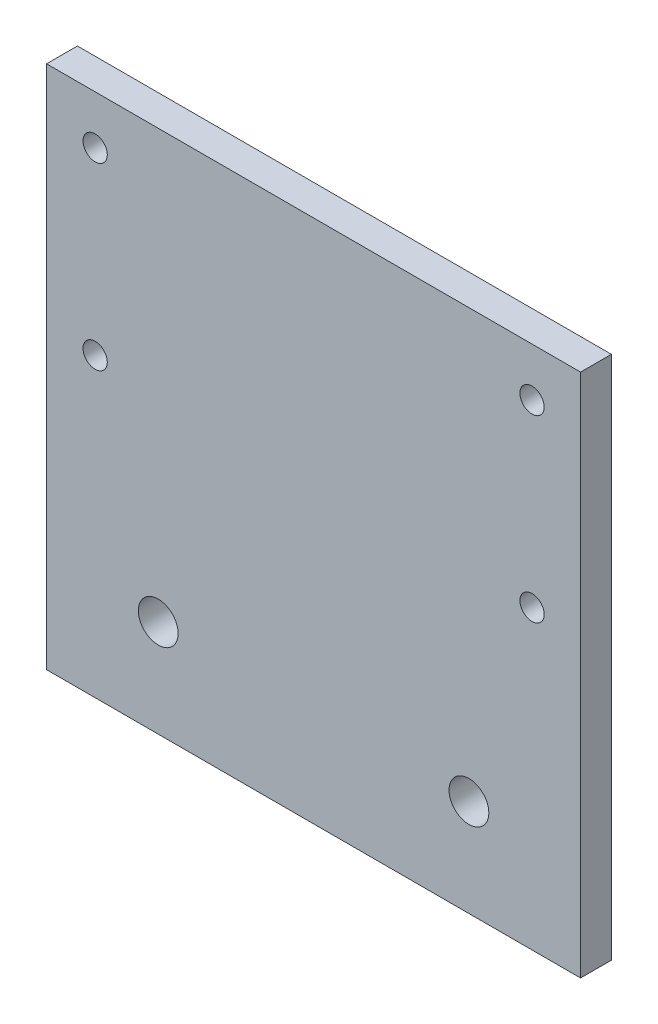
ISO-10303-21;
HEADER;
FILE_DESCRIPTION(('STEP AP214'),'2;1');
FILE_NAME('part.step','',(''),(''),'','','');
FILE_SCHEMA(('AUTOMOTIVE_DESIGN { 1 0 10303 214 1 1 1 1 }'));
ENDSEC;
DATA;
#1=APPLICATION_CONTEXT('core data for automotive mechanical design processes');
#2=APPLICATION_PROTOCOL_DEFINITION('international standard','automotive_design',2000,#1);
#3=PRODUCT_CONTEXT('',#1,'mechanical');
#4=PRODUCT('Part','Part','',(#3));
#5=PRODUCT_RELATED_PRODUCT_CATEGORY('part','',(#4));
#6=PRODUCT_DEFINITION_FORMATION('','',#4);
#7=PRODUCT_DEFINITION_CONTEXT('part definition',#1,'design');
#8=PRODUCT_DEFINITION('design','',#6,#7);
#9=PRODUCT_DEFINITION_SHAPE('','',#8);
#10=(LENGTH_UNIT() NAMED_UNIT(*) SI_UNIT(.MILLI.,.METRE.));
#11=(NAMED_UNIT(*) PLANE_ANGLE_UNIT() SI_UNIT($,.RADIAN.));
#12=(NAMED_UNIT(*) SI_UNIT($,.STERADIAN.) SOLID_ANGLE_UNIT());
#13=UNCERTAINTY_MEASURE_WITH_UNIT(LENGTH_MEASURE(1.E-05),#10,'distance_accuracy_value','');
#14=(GEOMETRIC_REPRESENTATION_CONTEXT(3) GLOBAL_UNCERTAINTY_ASSIGNED_CONTEXT((#13)) GLOBAL_UNIT_ASSIGNED_CONTEXT((#10,
#11,#12)) REPRESENTATION_CONTEXT('',''));
#15=CARTESIAN_POINT('',(0.,0.,0.));
#16=DIRECTION('',(0.,0.,1.));
#17=DIRECTION('',(1.,0.,0.));
#18=AXIS2_PLACEMENT_3D('',#15,#16,#17);
#19=CARTESIAN_POINT('',(0.,0.,3.175));
#20=DIRECTION('',(0.,0.,-1.));
#21=DIRECTION('',(-1.,0.,0.));
#22=AXIS2_PLACEMENT_3D('',#19,#20,#21);
#23=PLANE('',#22);
#24=DIRECTION('',(0.,-1.,0.));
#25=VECTOR('',#24,1.);
#26=CARTESIAN_POINT('',(0.,0.,3.175));
#27=LINE('',#26,#25);
#28=CARTESIAN_POINT('',(0.,54.05,3.175));
#29=VERTEX_POINT('',#28);
#30=CARTESIAN_POINT('',(0.,0.,3.175));
#31=VERTEX_POINT('',#30);
#32=EDGE_CURVE('E92',#29,#31,#27,.T.);
#33=ORIENTED_EDGE('',*,*,#32,.T.);
#34=DIRECTION('',(1.,0.,0.));
#35=VECTOR('',#34,1.);
#36=CARTESIAN_POINT('',(0.,0.,3.175));
#37=LINE('',#36,#35);
#38=CARTESIAN_POINT('',(55.,0.,3.175));
#39=VERTEX_POINT('',#38);
#40=EDGE_CURVE('E87',#31,#39,#37,.T.);
#41=ORIENTED_EDGE('',*,*,#40,.T.);
#42=DIRECTION('',(0.,1.,0.));
#43=VECTOR('',#42,1.);
#44=CARTESIAN_POINT('',(55.,0.,3.175));
#45=LINE('',#44,#43);
#46=CARTESIAN_POINT('',(55.,54.05,3.175));
#47=VERTEX_POINT('',#46);
#48=EDGE_CURVE('E90',#39,#47,#45,.T.);
#49=ORIENTED_EDGE('',*,*,#48,.T.);
#50=DIRECTION('',(-1.,0.,0.));
#51=VECTOR('',#50,1.);
#52=CARTESIAN_POINT('',(0.,54.05,3.175));
#53=LINE('',#52,#51);
#54=EDGE_CURVE('E57',#47,#29,#53,.T.);
#55=ORIENTED_EDGE('',*,*,#54,.T.);
#56=EDGE_LOOP('',(#33,#41,#49,#55));
#57=FACE_BOUND('',#56,.T.);
#58=CARTESIAN_POINT('',(4.99999999999999,49.05,3.175));
#59=DIRECTION('',(0.,0.,1.));
#60=DIRECTION('',(1.,0.,0.));
#61=AXIS2_PLACEMENT_3D('',#58,#59,#60);
#62=CIRCLE('',#61,1.25);
#63=CARTESIAN_POINT('',(6.24999999999999,49.05,3.175));
#64=VERTEX_POINT('',#63);
#65=EDGE_CURVE('E112',#64,#64,#62,.T.);
#66=ORIENTED_EDGE('',*,*,#65,.F.);
#67=EDGE_LOOP('',(#66));
#68=FACE_BOUND('',#67,.T.);
#69=CARTESIAN_POINT('',(11.5,9.99999999999999,3.175));
#70=DIRECTION('',(0.,0.,1.));
#71=DIRECTION('',(1.,0.,0.));
#72=AXIS2_PLACEMENT_3D('',#69,#70,#71);
#73=CIRCLE('',#72,2.05);
#74=CARTESIAN_POINT('',(13.55,9.99999999999999,3.175));
#75=VERTEX_POINT('',#74);
#76=EDGE_CURVE('E134',#75,#75,#73,.T.);
#77=ORIENTED_EDGE('',*,*,#76,.F.);
#78=EDGE_LOOP('',(#77));
#79=FACE_BOUND('',#78,.T.);
#80=CARTESIAN_POINT('',(50.,49.05,3.175));
#81=DIRECTION('',(0.,0.,1.));
#82=DIRECTION('',(1.,0.,0.));
#83=AXIS2_PLACEMENT_3D('',#80,#81,#82);
#84=CIRCLE('',#83,1.25);
#85=CARTESIAN_POINT('',(51.25,49.05,3.175));
#86=VERTEX_POINT('',#85);
#87=EDGE_CURVE('E142',#86,#86,#84,.T.);
#88=ORIENTED_EDGE('',*,*,#87,.F.);
#89=EDGE_LOOP('',(#88));
#90=FACE_BOUND('',#89,.T.);
#91=CARTESIAN_POINT('',(50.0000000000004,30.55,3.175));
#92=DIRECTION('',(0.,0.,1.));
#93=DIRECTION('',(1.,0.,0.));
#94=AXIS2_PLACEMENT_3D('',#91,#92,#93);
#95=CIRCLE('',#94,1.25);
#96=CARTESIAN_POINT('',(51.2500000000004,30.55,3.175));
#97=VERTEX_POINT('',#96);
#98=EDGE_CURVE('E150',#97,#97,#95,.T.);
#99=ORIENTED_EDGE('',*,*,#98,.F.);
#100=EDGE_LOOP('',(#99));
#101=FACE_BOUND('',#100,.T.);
#102=CARTESIAN_POINT('',(5.00000000000045,30.55,3.175));
#103=DIRECTION('',(0.,0.,1.));
#104=DIRECTION('',(1.,0.,0.));
#105=AXIS2_PLACEMENT_3D('',#102,#103,#104);
#106=CIRCLE('',#105,1.25);
#107=CARTESIAN_POINT('',(6.25000000000045,30.55,3.175));
#108=VERTEX_POINT('',#107);
#109=EDGE_CURVE('E158',#108,#108,#106,.T.);
#110=ORIENTED_EDGE('',*,*,#109,.F.);
#111=EDGE_LOOP('',(#110));
#112=FACE_BOUND('',#111,.T.);
#113=CARTESIAN_POINT('',(43.5,10.,3.175));
#114=DIRECTION('',(0.,0.,1.));
#115=DIRECTION('',(1.,0.,0.));
#116=AXIS2_PLACEMENT_3D('',#113,#114,#115);
#117=CIRCLE('',#116,2.05);
#118=CARTESIAN_POINT('',(45.55,10.,3.175));
#119=VERTEX_POINT('',#118);
#120=EDGE_CURVE('E166',#119,#119,#117,.T.);
#121=ORIENTED_EDGE('',*,*,#120,.F.);
#122=EDGE_LOOP('',(#121));
#123=FACE_BOUND('',#122,.T.);
#124=ADVANCED_FACE('F39',(#57,#68,#79,#90,#101,#112,#123),#23,.F.);
#125=CARTESIAN_POINT('',(0.,0.,0.));
#126=DIRECTION('',(0.,0.,-1.));
#127=DIRECTION('',(-1.,0.,0.));
#128=AXIS2_PLACEMENT_3D('',#125,#126,#127);
#129=PLANE('',#128);
#130=CARTESIAN_POINT('',(5.00000000000045,30.55,0.));
#131=DIRECTION('',(0.,0.,1.));
#132=DIRECTION('',(1.,0.,0.));
#133=AXIS2_PLACEMENT_3D('',#130,#131,#132);
#134=CIRCLE('',#133,1.25);
#135=CARTESIAN_POINT('',(6.25000000000045,30.55,0.));
#136=VERTEX_POINT('',#135);
#137=EDGE_CURVE('E162',#136,#136,#134,.T.);
#138=ORIENTED_EDGE('',*,*,#137,.T.);
#139=EDGE_LOOP('',(#138));
#140=FACE_BOUND('',#139,.T.);
#141=CARTESIAN_POINT('',(50.,49.05,0.));
#142=DIRECTION('',(0.,0.,1.));
#143=DIRECTION('',(1.,0.,0.));
#144=AXIS2_PLACEMENT_3D('',#141,#142,#143);
#145=CIRCLE('',#144,1.25);
#146=CARTESIAN_POINT('',(51.25,49.05,0.));
#147=VERTEX_POINT('',#146);
#148=EDGE_CURVE('E146',#147,#147,#145,.T.);
#149=ORIENTED_EDGE('',*,*,#148,.T.);
#150=EDGE_LOOP('',(#149));
#151=FACE_BOUND('',#150,.T.);
#152=CARTESIAN_POINT('',(4.99999999999999,49.05,0.));
#153=DIRECTION('',(0.,0.,1.));
#154=DIRECTION('',(1.,0.,0.));
#155=AXIS2_PLACEMENT_3D('',#152,#153,#154);
#156=CIRCLE('',#155,1.25);
#157=CARTESIAN_POINT('',(6.24999999999999,49.05,0.));
#158=VERTEX_POINT('',#157);
#159=EDGE_CURVE('E130',#158,#158,#156,.T.);
#160=ORIENTED_EDGE('',*,*,#159,.T.);
#161=EDGE_LOOP('',(#160));
#162=FACE_BOUND('',#161,.T.);
#163=DIRECTION('',(0.,-1.,0.));
#164=VECTOR('',#163,1.);
#165=CARTESIAN_POINT('',(0.,0.,0.));
#166=LINE('',#165,#164);
#167=CARTESIAN_POINT('',(0.,54.05,0.));
#168=VERTEX_POINT('',#167);
#169=CARTESIAN_POINT('',(0.,0.,0.));
#170=VERTEX_POINT('',#169);
#171=EDGE_CURVE('E108',#168,#170,#166,.T.);
#172=ORIENTED_EDGE('',*,*,#171,.F.);
#173=DIRECTION('',(-1.,0.,0.));
#174=VECTOR('',#173,1.);
#175=CARTESIAN_POINT('',(0.,54.05,0.));
#176=LINE('',#175,#174);
#177=CARTESIAN_POINT('',(55.,54.05,0.));
#178=VERTEX_POINT('',#177);
#179=EDGE_CURVE('E80',#178,#168,#176,.T.);
#180=ORIENTED_EDGE('',*,*,#179,.F.);
#181=DIRECTION('',(0.,1.,0.));
#182=VECTOR('',#181,1.);
#183=CARTESIAN_POINT('',(55.,0.,0.));
#184=LINE('',#183,#182);
#185=CARTESIAN_POINT('',(55.,0.,0.));
#186=VERTEX_POINT('',#185);
#187=EDGE_CURVE('E74',#186,#178,#184,.T.);
#188=ORIENTED_EDGE('',*,*,#187,.F.);
#189=DIRECTION('',(1.,0.,0.));
#190=VECTOR('',#189,1.);
#191=CARTESIAN_POINT('',(0.,0.,0.));
#192=LINE('',#191,#190);
#193=EDGE_CURVE('E97',#170,#186,#192,.T.);
#194=ORIENTED_EDGE('',*,*,#193,.F.);
#195=EDGE_LOOP('',(#172,#180,#188,#194));
#196=FACE_BOUND('',#195,.T.);
#197=CARTESIAN_POINT('',(11.5,9.99999999999999,0.));
#198=DIRECTION('',(0.,0.,1.));
#199=DIRECTION('',(1.,0.,0.));
#200=AXIS2_PLACEMENT_3D('',#197,#198,#199);
#201=CIRCLE('',#200,2.05);
#202=CARTESIAN_POINT('',(13.55,9.99999999999999,0.));
#203=VERTEX_POINT('',#202);
#204=EDGE_CURVE('E138',#203,#203,#201,.T.);
#205=ORIENTED_EDGE('',*,*,#204,.T.);
#206=EDGE_LOOP('',(#205));
#207=FACE_BOUND('',#206,.T.);
#208=CARTESIAN_POINT('',(50.0000000000004,30.55,0.));
#209=DIRECTION('',(0.,0.,1.));
#210=DIRECTION('',(1.,0.,0.));
#211=AXIS2_PLACEMENT_3D('',#208,#209,#210);
#212=CIRCLE('',#211,1.25);
#213=CARTESIAN_POINT('',(51.2500000000004,30.55,0.));
#214=VERTEX_POINT('',#213);
#215=EDGE_CURVE('E154',#214,#214,#212,.T.);
#216=ORIENTED_EDGE('',*,*,#215,.T.);
#217=EDGE_LOOP('',(#216));
#218=FACE_BOUND('',#217,.T.);
#219=CARTESIAN_POINT('',(43.5,10.,0.));
#220=DIRECTION('',(0.,0.,1.));
#221=DIRECTION('',(1.,0.,0.));
#222=AXIS2_PLACEMENT_3D('',#219,#220,#221);
#223=CIRCLE('',#222,2.05);
#224=CARTESIAN_POINT('',(45.55,10.,0.));
#225=VERTEX_POINT('',#224);
#226=EDGE_CURVE('E170',#225,#225,#223,.T.);
#227=ORIENTED_EDGE('',*,*,#226,.T.);
#228=EDGE_LOOP('',(#227));
#229=FACE_BOUND('',#228,.T.);
#230=ADVANCED_FACE('F125',(#140,#151,#162,#196,#207,#218,#229),#129,.T.);
#231=CARTESIAN_POINT('',(0.,0.,3.175));
#232=DIRECTION('',(1.,0.,0.));
#233=DIRECTION('',(0.,0.,-1.));
#234=AXIS2_PLACEMENT_3D('',#231,#232,#233);
#235=PLANE('',#234);
#236=ORIENTED_EDGE('',*,*,#171,.T.);
#237=DIRECTION('',(0.,0.,-1.));
#238=VECTOR('',#237,1.);
#239=CARTESIAN_POINT('',(0.,0.,3.175));
#240=LINE('',#239,#238);
#241=EDGE_CURVE('E11',#31,#170,#240,.T.);
#242=ORIENTED_EDGE('',*,*,#241,.F.);
#243=ORIENTED_EDGE('',*,*,#32,.F.);
#244=DIRECTION('',(0.,0.,-1.));
#245=VECTOR('',#244,1.);
#246=CARTESIAN_POINT('',(0.,54.05,3.175));
#247=LINE('',#246,#245);
#248=EDGE_CURVE('E104',#29,#168,#247,.T.);
#249=ORIENTED_EDGE('',*,*,#248,.T.);
#250=EDGE_LOOP('',(#236,#242,#243,#249));
#251=FACE_BOUND('',#250,.T.);
#252=ADVANCED_FACE('F41',(#251),#235,.F.);
#253=CARTESIAN_POINT('',(0.,0.,3.175));
#254=DIRECTION('',(0.,1.,0.));
#255=DIRECTION('',(-1.,0.,0.));
#256=AXIS2_PLACEMENT_3D('',#253,#254,#255);
#257=PLANE('',#256);
#258=ORIENTED_EDGE('',*,*,#193,.T.);
#259=DIRECTION('',(0.,0.,-1.));
#260=VECTOR('',#259,1.);
#261=CARTESIAN_POINT('',(55.,0.,3.175));
#262=LINE('',#261,#260);
#263=EDGE_CURVE('E49',#39,#186,#262,.T.);
#264=ORIENTED_EDGE('',*,*,#263,.F.);
#265=ORIENTED_EDGE('',*,*,#40,.F.);
#266=ORIENTED_EDGE('',*,*,#241,.T.);
#267=EDGE_LOOP('',(#258,#264,#265,#266));
#268=FACE_BOUND('',#267,.T.);
#269=ADVANCED_FACE('F96',(#268),#257,.F.);
#270=CARTESIAN_POINT('',(55.,0.,3.175));
#271=DIRECTION('',(-1.,0.,0.));
#272=DIRECTION('',(0.,-1.,0.));
#273=AXIS2_PLACEMENT_3D('',#270,#271,#272);
#274=PLANE('',#273);
#275=ORIENTED_EDGE('',*,*,#187,.T.);
#276=DIRECTION('',(0.,0.,-1.));
#277=VECTOR('',#276,1.);
#278=CARTESIAN_POINT('',(55.,54.05,3.175));
#279=LINE('',#278,#277);
#280=EDGE_CURVE('E99',#47,#178,#279,.T.);
#281=ORIENTED_EDGE('',*,*,#280,.F.);
#282=ORIENTED_EDGE('',*,*,#48,.F.);
#283=ORIENTED_EDGE('',*,*,#263,.T.);
#284=EDGE_LOOP('',(#275,#281,#282,#283));
#285=FACE_BOUND('',#284,.T.);
#286=ADVANCED_FACE('F100',(#285),#274,.F.);
#287=CARTESIAN_POINT('',(0.,54.05,3.175));
#288=DIRECTION('',(0.,-1.,0.));
#289=DIRECTION('',(1.,0.,0.));
#290=AXIS2_PLACEMENT_3D('',#287,#288,#289);
#291=PLANE('',#290);
#292=ORIENTED_EDGE('',*,*,#179,.T.);
#293=ORIENTED_EDGE('',*,*,#248,.F.);
#294=ORIENTED_EDGE('',*,*,#54,.F.);
#295=ORIENTED_EDGE('',*,*,#280,.T.);
#296=EDGE_LOOP('',(#292,#293,#294,#295));
#297=FACE_BOUND('',#296,.T.);
#298=ADVANCED_FACE('F122',(#297),#291,.F.);
#299=CARTESIAN_POINT('',(4.99999999999999,49.05,3.175));
#300=DIRECTION('',(0.,0.,-1.));
#301=DIRECTION('',(-1.,0.,0.));
#302=AXIS2_PLACEMENT_3D('',#299,#300,#301);
#303=CYLINDRICAL_SURFACE('',#302,1.25);
#304=ORIENTED_EDGE('',*,*,#65,.T.);
#305=EDGE_LOOP('',(#304));
#306=FACE_BOUND('',#305,.T.);
#307=ORIENTED_EDGE('',*,*,#159,.F.);
#308=EDGE_LOOP('',(#307));
#309=FACE_BOUND('',#308,.T.);
#310=ADVANCED_FACE('F189',(#306,#309),#303,.F.);
#311=CARTESIAN_POINT('',(11.5,9.99999999999999,3.175));
#312=DIRECTION('',(0.,0.,-1.));
#313=DIRECTION('',(-1.,0.,0.));
#314=AXIS2_PLACEMENT_3D('',#311,#312,#313);
#315=CYLINDRICAL_SURFACE('',#314,2.05);
#316=ORIENTED_EDGE('',*,*,#76,.T.);
#317=EDGE_LOOP('',(#316));
#318=FACE_BOUND('',#317,.T.);
#319=ORIENTED_EDGE('',*,*,#204,.F.);
#320=EDGE_LOOP('',(#319));
#321=FACE_BOUND('',#320,.T.);
#322=ADVANCED_FACE('F235',(#318,#321),#315,.F.);
#323=CARTESIAN_POINT('',(50.,49.05,3.175));
#324=DIRECTION('',(0.,0.,-1.));
#325=DIRECTION('',(-1.,0.,0.));
#326=AXIS2_PLACEMENT_3D('',#323,#324,#325);
#327=CYLINDRICAL_SURFACE('',#326,1.25);
#328=ORIENTED_EDGE('',*,*,#87,.T.);
#329=EDGE_LOOP('',(#328));
#330=FACE_BOUND('',#329,.T.);
#331=ORIENTED_EDGE('',*,*,#148,.F.);
#332=EDGE_LOOP('',(#331));
#333=FACE_BOUND('',#332,.T.);
#334=ADVANCED_FACE('F243',(#330,#333),#327,.F.);
#335=CARTESIAN_POINT('',(50.0000000000004,30.55,3.175));
#336=DIRECTION('',(0.,0.,-1.));
#337=DIRECTION('',(-1.,0.,0.));
#338=AXIS2_PLACEMENT_3D('',#335,#336,#337);
#339=CYLINDRICAL_SURFACE('',#338,1.25);
#340=ORIENTED_EDGE('',*,*,#98,.T.);
#341=EDGE_LOOP('',(#340));
#342=FACE_BOUND('',#341,.T.);
#343=ORIENTED_EDGE('',*,*,#215,.F.);
#344=EDGE_LOOP('',(#343));
#345=FACE_BOUND('',#344,.T.);
#346=ADVANCED_FACE('F251',(#342,#345),#339,.F.);
#347=CARTESIAN_POINT('',(5.00000000000045,30.55,3.175));
#348=DIRECTION('',(0.,0.,-1.));
#349=DIRECTION('',(-1.,0.,0.));
#350=AXIS2_PLACEMENT_3D('',#347,#348,#349);
#351=CYLINDRICAL_SURFACE('',#350,1.25);
#352=ORIENTED_EDGE('',*,*,#109,.T.);
#353=EDGE_LOOP('',(#352));
#354=FACE_BOUND('',#353,.T.);
#355=ORIENTED_EDGE('',*,*,#137,.F.);
#356=EDGE_LOOP('',(#355));
#357=FACE_BOUND('',#356,.T.);
#358=ADVANCED_FACE('F260',(#354,#357),#351,.F.);
#359=CARTESIAN_POINT('',(43.5,10.,3.175));
#360=DIRECTION('',(0.,0.,-1.));
#361=DIRECTION('',(-1.,0.,0.));
#362=AXIS2_PLACEMENT_3D('',#359,#360,#361);
#363=CYLINDRICAL_SURFACE('',#362,2.05);
#364=ORIENTED_EDGE('',*,*,#120,.T.);
#365=EDGE_LOOP('',(#364));
#366=FACE_BOUND('',#365,.T.);
#367=ORIENTED_EDGE('',*,*,#226,.F.);
#368=EDGE_LOOP('',(#367));
#369=FACE_BOUND('',#368,.T.);
#370=ADVANCED_FACE('F178',(#366,#369),#363,.F.);
#371=CLOSED_SHELL('',(#124,#230,#252,#269,#286,#298,#310,#322,#334,#346,#358,#370));
#372=MANIFOLD_SOLID_BREP('B2',#371);
#373=ADVANCED_BREP_SHAPE_REPRESENTATION('',(#18,#372),#14);
#374=SHAPE_DEFINITION_REPRESENTATION(#9,#373);
ENDSEC;
END-ISO-10303-21;
